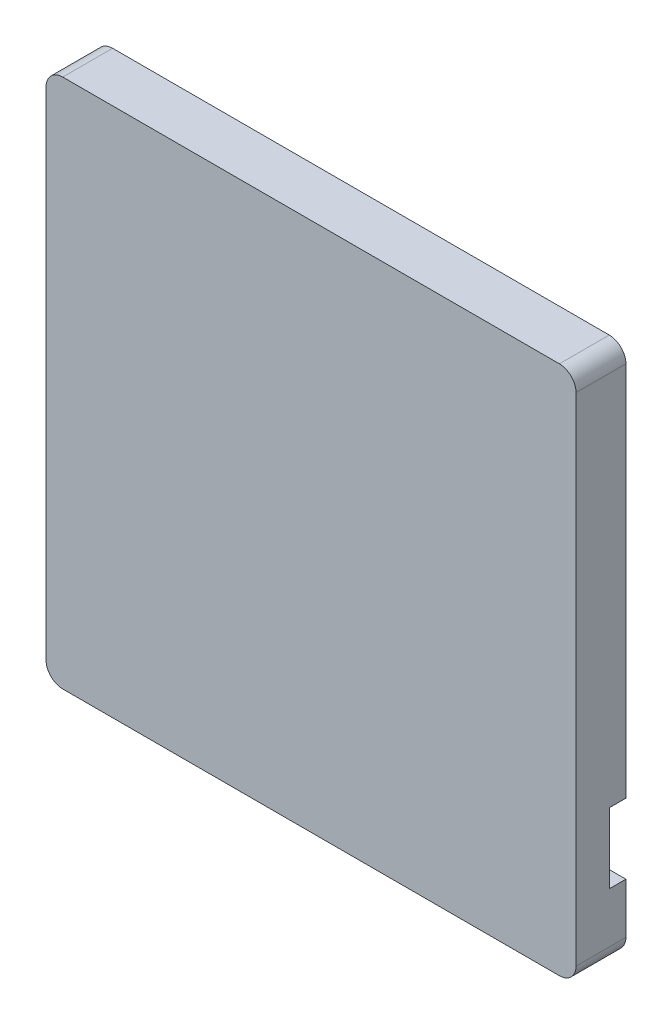
ISO-10303-21;
HEADER;
FILE_DESCRIPTION(('STEP AP214'),'2;1');
FILE_NAME('part.step','',(''),(''),'','','');
FILE_SCHEMA(('AUTOMOTIVE_DESIGN { 1 0 10303 214 1 1 1 1 }'));
ENDSEC;
DATA;
#1=APPLICATION_CONTEXT('core data for automotive mechanical design processes');
#2=APPLICATION_PROTOCOL_DEFINITION('international standard','automotive_design',2000,#1);
#3=PRODUCT_CONTEXT('',#1,'mechanical');
#4=PRODUCT('Part','Part','',(#3));
#5=PRODUCT_RELATED_PRODUCT_CATEGORY('part','',(#4));
#6=PRODUCT_DEFINITION_FORMATION('','',#4);
#7=PRODUCT_DEFINITION_CONTEXT('part definition',#1,'design');
#8=PRODUCT_DEFINITION('design','',#6,#7);
#9=PRODUCT_DEFINITION_SHAPE('','',#8);
#10=(LENGTH_UNIT() NAMED_UNIT(*) SI_UNIT(.MILLI.,.METRE.));
#11=(NAMED_UNIT(*) PLANE_ANGLE_UNIT() SI_UNIT($,.RADIAN.));
#12=(NAMED_UNIT(*) SI_UNIT($,.STERADIAN.) SOLID_ANGLE_UNIT());
#13=UNCERTAINTY_MEASURE_WITH_UNIT(LENGTH_MEASURE(1.E-05),#10,'distance_accuracy_value','');
#14=(GEOMETRIC_REPRESENTATION_CONTEXT(3) GLOBAL_UNCERTAINTY_ASSIGNED_CONTEXT((#13)) GLOBAL_UNIT_ASSIGNED_CONTEXT((#10,
#11,#12)) REPRESENTATION_CONTEXT('',''));
#15=CARTESIAN_POINT('',(0.,0.,0.));
#16=DIRECTION('',(0.,0.,1.));
#17=DIRECTION('',(1.,0.,0.));
#18=AXIS2_PLACEMENT_3D('',#15,#16,#17);
#19=CARTESIAN_POINT('',(101.887359685943,-74.7948066727813,10.));
#20=DIRECTION('',(0.,0.,-1.));
#21=DIRECTION('',(-1.,0.,0.));
#22=AXIS2_PLACEMENT_3D('',#19,#20,#21);
#23=CYLINDRICAL_SURFACE('',#22,13.);
#24=CARTESIAN_POINT('',(101.887359685943,-74.7948066727813,0.));
#25=DIRECTION('',(0.,0.,1.));
#26=DIRECTION('',(1.,0.,0.));
#27=AXIS2_PLACEMENT_3D('',#24,#25,#26);
#28=CIRCLE('',#27,13.);
#29=CARTESIAN_POINT('',(101.887359685943,-87.7948066727813,0.));
#30=VERTEX_POINT('',#29);
#31=CARTESIAN_POINT('',(108.887359685943,-85.7492578228846,0.));
#32=VERTEX_POINT('',#31);
#33=EDGE_CURVE('E279',#30,#32,#28,.T.);
#34=ORIENTED_EDGE('',*,*,#33,.F.);
#35=DIRECTION('',(0.,0.,-1.));
#36=VECTOR('',#35,1.);
#37=CARTESIAN_POINT('',(101.887359685943,-87.7948066727813,10.));
#38=LINE('',#37,#36);
#39=CARTESIAN_POINT('',(101.887359685943,-87.7948066727813,10.));
#40=VERTEX_POINT('',#39);
#41=EDGE_CURVE('E251',#40,#30,#38,.T.);
#42=ORIENTED_EDGE('',*,*,#41,.F.);
#43=CARTESIAN_POINT('',(101.887359685943,-74.7948066727813,10.));
#44=DIRECTION('',(0.,0.,1.));
#45=DIRECTION('',(1.,0.,0.));
#46=AXIS2_PLACEMENT_3D('',#43,#44,#45);
#47=CIRCLE('',#46,13.);
#48=CARTESIAN_POINT('',(108.887359685943,-85.7492578228846,10.));
#49=VERTEX_POINT('',#48);
#50=EDGE_CURVE('E246',#40,#49,#47,.T.);
#51=ORIENTED_EDGE('',*,*,#50,.T.);
#52=DIRECTION('',(0.,0.,-1.));
#53=VECTOR('',#52,1.);
#54=CARTESIAN_POINT('',(108.887359685943,-85.7492578228846,10.));
#55=LINE('',#54,#53);
#56=EDGE_CURVE('E249',#49,#32,#55,.T.);
#57=ORIENTED_EDGE('',*,*,#56,.T.);
#58=EDGE_LOOP('',(#34,#42,#51,#57));
#59=FACE_BOUND('',#58,.T.);
#60=ADVANCED_FACE('F43',(#59),#23,.F.);
#61=CARTESIAN_POINT('',(0.,-87.7948066727813,10.));
#62=DIRECTION('',(0.,1.,0.));
#63=DIRECTION('',(0.,0.,1.));
#64=AXIS2_PLACEMENT_3D('',#61,#62,#63);
#65=PLANE('',#64);
#66=DIRECTION('',(1.,0.,0.));
#67=VECTOR('',#66,1.);
#68=CARTESIAN_POINT('',(0.,-87.7948066727813,0.));
#69=LINE('',#68,#67);
#70=CARTESIAN_POINT('',(77.887359685943,-87.7948066727813,0.));
#71=VERTEX_POINT('',#70);
#72=EDGE_CURVE('E281',#71,#30,#69,.T.);
#73=ORIENTED_EDGE('',*,*,#72,.F.);
#74=DIRECTION('',(0.,0.,-1.));
#75=VECTOR('',#74,1.);
#76=CARTESIAN_POINT('',(77.887359685943,-87.7948066727813,10.));
#77=LINE('',#76,#75);
#78=CARTESIAN_POINT('',(77.887359685943,-87.7948066727813,10.));
#79=VERTEX_POINT('',#78);
#80=EDGE_CURVE('E394',#79,#71,#77,.T.);
#81=ORIENTED_EDGE('',*,*,#80,.F.);
#82=DIRECTION('',(1.,0.,0.));
#83=VECTOR('',#82,1.);
#84=CARTESIAN_POINT('',(0.,-87.7948066727813,10.));
#85=LINE('',#84,#83);
#86=EDGE_CURVE('E256',#79,#40,#85,.T.);
#87=ORIENTED_EDGE('',*,*,#86,.T.);
#88=ORIENTED_EDGE('',*,*,#41,.T.);
#89=EDGE_LOOP('',(#73,#81,#87,#88));
#90=FACE_BOUND('',#89,.T.);
#91=ADVANCED_FACE('F530',(#90),#65,.T.);
#92=CARTESIAN_POINT('',(77.887359685943,0.,10.));
#93=DIRECTION('',(-1.,0.,0.));
#94=DIRECTION('',(0.,0.,1.));
#95=AXIS2_PLACEMENT_3D('',#92,#93,#94);
#96=PLANE('',#95);
#97=DIRECTION('',(0.,1.,0.));
#98=VECTOR('',#97,1.);
#99=CARTESIAN_POINT('',(77.887359685943,0.,0.));
#100=LINE('',#99,#98);
#101=CARTESIAN_POINT('',(77.887359685943,-121.794806672781,0.));
#102=VERTEX_POINT('',#101);
#103=EDGE_CURVE('E285',#102,#71,#100,.T.);
#104=ORIENTED_EDGE('',*,*,#103,.F.);
#105=DIRECTION('',(0.,0.,-1.));
#106=VECTOR('',#105,1.);
#107=CARTESIAN_POINT('',(77.887359685943,-121.794806672781,10.));
#108=LINE('',#107,#106);
#109=CARTESIAN_POINT('',(77.887359685943,-121.794806672781,10.));
#110=VERTEX_POINT('',#109);
#111=EDGE_CURVE('E392',#110,#102,#108,.T.);
#112=ORIENTED_EDGE('',*,*,#111,.F.);
#113=DIRECTION('',(0.,1.,0.));
#114=VECTOR('',#113,1.);
#115=CARTESIAN_POINT('',(77.887359685943,0.,10.));
#116=LINE('',#115,#114);
#117=EDGE_CURVE('E464',#110,#79,#116,.T.);
#118=ORIENTED_EDGE('',*,*,#117,.T.);
#119=ORIENTED_EDGE('',*,*,#80,.T.);
#120=EDGE_LOOP('',(#104,#112,#118,#119));
#121=FACE_BOUND('',#120,.T.);
#122=ADVANCED_FACE('F535',(#121),#96,.T.);
#123=CARTESIAN_POINT('',(0.,-121.794806672781,10.));
#124=DIRECTION('',(0.,1.,0.));
#125=DIRECTION('',(0.,0.,1.));
#126=AXIS2_PLACEMENT_3D('',#123,#124,#125);
#127=PLANE('',#126);
#128=DIRECTION('',(1.,0.,0.));
#129=VECTOR('',#128,1.);
#130=CARTESIAN_POINT('',(0.,-121.794806672781,0.));
#131=LINE('',#130,#129);
#132=CARTESIAN_POINT('',(-54.112640314057,-121.794806672781,0.));
#133=VERTEX_POINT('',#132);
#134=EDGE_CURVE('E288',#133,#102,#131,.T.);
#135=ORIENTED_EDGE('',*,*,#134,.F.);
#136=DIRECTION('',(0.,0.,-1.));
#137=VECTOR('',#136,1.);
#138=CARTESIAN_POINT('',(-54.112640314057,-121.794806672781,10.));
#139=LINE('',#138,#137);
#140=CARTESIAN_POINT('',(-54.112640314057,-121.794806672781,10.));
#141=VERTEX_POINT('',#140);
#142=EDGE_CURVE('E390',#141,#133,#139,.T.);
#143=ORIENTED_EDGE('',*,*,#142,.F.);
#144=DIRECTION('',(1.,0.,0.));
#145=VECTOR('',#144,1.);
#146=CARTESIAN_POINT('',(0.,-121.794806672781,10.));
#147=LINE('',#146,#145);
#148=EDGE_CURVE('E467',#141,#110,#147,.T.);
#149=ORIENTED_EDGE('',*,*,#148,.T.);
#150=ORIENTED_EDGE('',*,*,#111,.T.);
#151=EDGE_LOOP('',(#135,#143,#149,#150));
#152=FACE_BOUND('',#151,.T.);
#153=ADVANCED_FACE('F727',(#152),#127,.T.);
#154=CARTESIAN_POINT('',(-54.112640314057,0.,10.));
#155=DIRECTION('',(1.,0.,0.));
#156=DIRECTION('',(0.,0.,-1.));
#157=AXIS2_PLACEMENT_3D('',#154,#155,#156);
#158=PLANE('',#157);
#159=DIRECTION('',(0.,-1.,0.));
#160=VECTOR('',#159,1.);
#161=CARTESIAN_POINT('',(-54.112640314057,0.,0.));
#162=LINE('',#161,#160);
#163=CARTESIAN_POINT('',(-54.112640314057,-87.7948066727813,0.));
#164=VERTEX_POINT('',#163);
#165=EDGE_CURVE('E291',#164,#133,#162,.T.);
#166=ORIENTED_EDGE('',*,*,#165,.F.);
#167=DIRECTION('',(0.,0.,-1.));
#168=VECTOR('',#167,1.);
#169=CARTESIAN_POINT('',(-54.112640314057,-87.7948066727813,10.));
#170=LINE('',#169,#168);
#171=CARTESIAN_POINT('',(-54.112640314057,-87.7948066727813,10.));
#172=VERTEX_POINT('',#171);
#173=EDGE_CURVE('E388',#172,#164,#170,.T.);
#174=ORIENTED_EDGE('',*,*,#173,.F.);
#175=DIRECTION('',(0.,-1.,0.));
#176=VECTOR('',#175,1.);
#177=CARTESIAN_POINT('',(-54.112640314057,0.,10.));
#178=LINE('',#177,#176);
#179=EDGE_CURVE('E470',#172,#141,#178,.T.);
#180=ORIENTED_EDGE('',*,*,#179,.T.);
#181=ORIENTED_EDGE('',*,*,#142,.T.);
#182=EDGE_LOOP('',(#166,#174,#180,#181));
#183=FACE_BOUND('',#182,.T.);
#184=ADVANCED_FACE('F723',(#183),#158,.T.);
#185=CARTESIAN_POINT('',(0.,-87.7948066727813,10.));
#186=DIRECTION('',(0.,1.,0.));
#187=DIRECTION('',(0.,0.,1.));
#188=AXIS2_PLACEMENT_3D('',#185,#186,#187);
#189=PLANE('',#188);
#190=DIRECTION('',(1.,0.,0.));
#191=VECTOR('',#190,1.);
#192=CARTESIAN_POINT('',(0.,-87.7948066727813,0.));
#193=LINE('',#192,#191);
#194=CARTESIAN_POINT('',(-78.112640314057,-87.7948066727813,0.));
#195=VERTEX_POINT('',#194);
#196=EDGE_CURVE('E294',#195,#164,#193,.T.);
#197=ORIENTED_EDGE('',*,*,#196,.F.);
#198=DIRECTION('',(0.,0.,-1.));
#199=VECTOR('',#198,1.);
#200=CARTESIAN_POINT('',(-78.112640314057,-87.7948066727813,10.));
#201=LINE('',#200,#199);
#202=CARTESIAN_POINT('',(-78.112640314057,-87.7948066727813,10.));
#203=VERTEX_POINT('',#202);
#204=EDGE_CURVE('E386',#203,#195,#201,.T.);
#205=ORIENTED_EDGE('',*,*,#204,.F.);
#206=DIRECTION('',(1.,0.,0.));
#207=VECTOR('',#206,1.);
#208=CARTESIAN_POINT('',(0.,-87.7948066727813,10.));
#209=LINE('',#208,#207);
#210=EDGE_CURVE('E473',#203,#172,#209,.T.);
#211=ORIENTED_EDGE('',*,*,#210,.T.);
#212=ORIENTED_EDGE('',*,*,#173,.T.);
#213=EDGE_LOOP('',(#197,#205,#211,#212));
#214=FACE_BOUND('',#213,.T.);
#215=ADVANCED_FACE('F719',(#214),#189,.T.);
#216=CARTESIAN_POINT('',(-78.112640314057,-74.7948066727813,10.));
#217=DIRECTION('',(0.,0.,-1.));
#218=DIRECTION('',(-1.,0.,0.));
#219=AXIS2_PLACEMENT_3D('',#216,#217,#218);
#220=CYLINDRICAL_SURFACE('',#219,13.);
#221=CARTESIAN_POINT('',(-78.112640314057,-74.7948066727813,0.));
#222=DIRECTION('',(0.,0.,1.));
#223=DIRECTION('',(1.,0.,0.));
#224=AXIS2_PLACEMENT_3D('',#221,#222,#223);
#225=CIRCLE('',#224,13.);
#226=CARTESIAN_POINT('',(-91.112640314057,-74.7948066727813,0.));
#227=VERTEX_POINT('',#226);
#228=EDGE_CURVE('E297',#227,#195,#225,.T.);
#229=ORIENTED_EDGE('',*,*,#228,.F.);
#230=DIRECTION('',(0.,0.,-1.));
#231=VECTOR('',#230,1.);
#232=CARTESIAN_POINT('',(-91.112640314057,-74.7948066727813,10.));
#233=LINE('',#232,#231);
#234=CARTESIAN_POINT('',(-91.112640314057,-74.7948066727813,10.));
#235=VERTEX_POINT('',#234);
#236=EDGE_CURVE('E384',#235,#227,#233,.T.);
#237=ORIENTED_EDGE('',*,*,#236,.F.);
#238=CARTESIAN_POINT('',(-78.112640314057,-74.7948066727813,10.));
#239=DIRECTION('',(0.,0.,1.));
#240=DIRECTION('',(1.,0.,0.));
#241=AXIS2_PLACEMENT_3D('',#238,#239,#240);
#242=CIRCLE('',#241,13.);
#243=EDGE_CURVE('E476',#235,#203,#242,.T.);
#244=ORIENTED_EDGE('',*,*,#243,.T.);
#245=ORIENTED_EDGE('',*,*,#204,.T.);
#246=EDGE_LOOP('',(#229,#237,#244,#245));
#247=FACE_BOUND('',#246,.T.);
#248=ADVANCED_FACE('F715',(#247),#220,.F.);
#249=CARTESIAN_POINT('',(-91.112640314057,0.,10.));
#250=DIRECTION('',(1.,0.,0.));
#251=DIRECTION('',(0.,0.,-1.));
#252=AXIS2_PLACEMENT_3D('',#249,#250,#251);
#253=PLANE('',#252);
#254=DIRECTION('',(0.,-1.,0.));
#255=VECTOR('',#254,1.);
#256=CARTESIAN_POINT('',(-91.112640314057,0.,0.));
#257=LINE('',#256,#255);
#258=CARTESIAN_POINT('',(-91.112640314057,87.2051933272187,0.));
#259=VERTEX_POINT('',#258);
#260=EDGE_CURVE('E300',#259,#227,#257,.T.);
#261=ORIENTED_EDGE('',*,*,#260,.F.);
#262=DIRECTION('',(0.,0.,-1.));
#263=VECTOR('',#262,1.);
#264=CARTESIAN_POINT('',(-91.112640314057,87.2051933272187,10.));
#265=LINE('',#264,#263);
#266=CARTESIAN_POINT('',(-91.112640314057,87.2051933272187,10.));
#267=VERTEX_POINT('',#266);
#268=EDGE_CURVE('E382',#267,#259,#265,.T.);
#269=ORIENTED_EDGE('',*,*,#268,.F.);
#270=DIRECTION('',(0.,-1.,0.));
#271=VECTOR('',#270,1.);
#272=CARTESIAN_POINT('',(-91.112640314057,0.,10.));
#273=LINE('',#272,#271);
#274=EDGE_CURVE('E479',#267,#235,#273,.T.);
#275=ORIENTED_EDGE('',*,*,#274,.T.);
#276=ORIENTED_EDGE('',*,*,#236,.T.);
#277=EDGE_LOOP('',(#261,#269,#275,#276));
#278=FACE_BOUND('',#277,.T.);
#279=ADVANCED_FACE('F711',(#278),#253,.T.);
#280=CARTESIAN_POINT('',(-78.112640314057,87.2051933272187,10.));
#281=DIRECTION('',(0.,0.,-1.));
#282=DIRECTION('',(-1.,0.,0.));
#283=AXIS2_PLACEMENT_3D('',#280,#281,#282);
#284=CYLINDRICAL_SURFACE('',#283,13.);
#285=CARTESIAN_POINT('',(-78.112640314057,87.2051933272187,0.));
#286=DIRECTION('',(0.,0.,1.));
#287=DIRECTION('',(1.,0.,0.));
#288=AXIS2_PLACEMENT_3D('',#285,#286,#287);
#289=CIRCLE('',#288,13.);
#290=CARTESIAN_POINT('',(-78.112640314057,100.205193327219,0.));
#291=VERTEX_POINT('',#290);
#292=EDGE_CURVE('E303',#291,#259,#289,.T.);
#293=ORIENTED_EDGE('',*,*,#292,.F.);
#294=DIRECTION('',(0.,0.,-1.));
#295=VECTOR('',#294,1.);
#296=CARTESIAN_POINT('',(-78.112640314057,100.205193327219,10.));
#297=LINE('',#296,#295);
#298=CARTESIAN_POINT('',(-78.112640314057,100.205193327219,10.));
#299=VERTEX_POINT('',#298);
#300=EDGE_CURVE('E380',#299,#291,#297,.T.);
#301=ORIENTED_EDGE('',*,*,#300,.F.);
#302=CARTESIAN_POINT('',(-78.112640314057,87.2051933272187,10.));
#303=DIRECTION('',(0.,0.,1.));
#304=DIRECTION('',(1.,0.,0.));
#305=AXIS2_PLACEMENT_3D('',#302,#303,#304);
#306=CIRCLE('',#305,13.);
#307=EDGE_CURVE('E482',#299,#267,#306,.T.);
#308=ORIENTED_EDGE('',*,*,#307,.T.);
#309=ORIENTED_EDGE('',*,*,#268,.T.);
#310=EDGE_LOOP('',(#293,#301,#308,#309));
#311=FACE_BOUND('',#310,.T.);
#312=ADVANCED_FACE('F707',(#311),#284,.F.);
#313=CARTESIAN_POINT('',(0.,100.205193327219,10.));
#314=DIRECTION('',(0.,-1.,0.));
#315=DIRECTION('',(1.,0.,0.));
#316=AXIS2_PLACEMENT_3D('',#313,#314,#315);
#317=PLANE('',#316);
#318=DIRECTION('',(-1.,0.,0.));
#319=VECTOR('',#318,1.);
#320=CARTESIAN_POINT('',(0.,100.205193327219,0.));
#321=LINE('',#320,#319);
#322=CARTESIAN_POINT('',(101.887359685943,100.205193327219,0.));
#323=VERTEX_POINT('',#322);
#324=EDGE_CURVE('E306',#323,#291,#321,.T.);
#325=ORIENTED_EDGE('',*,*,#324,.F.);
#326=DIRECTION('',(0.,0.,-1.));
#327=VECTOR('',#326,1.);
#328=CARTESIAN_POINT('',(101.887359685943,100.205193327219,10.));
#329=LINE('',#328,#327);
#330=CARTESIAN_POINT('',(101.887359685943,100.205193327219,10.));
#331=VERTEX_POINT('',#330);
#332=EDGE_CURVE('E378',#331,#323,#329,.T.);
#333=ORIENTED_EDGE('',*,*,#332,.F.);
#334=DIRECTION('',(-1.,0.,0.));
#335=VECTOR('',#334,1.);
#336=CARTESIAN_POINT('',(0.,100.205193327219,10.));
#337=LINE('',#336,#335);
#338=EDGE_CURVE('E485',#331,#299,#337,.T.);
#339=ORIENTED_EDGE('',*,*,#338,.T.);
#340=ORIENTED_EDGE('',*,*,#300,.T.);
#341=EDGE_LOOP('',(#325,#333,#339,#340));
#342=FACE_BOUND('',#341,.T.);
#343=ADVANCED_FACE('F703',(#342),#317,.T.);
#344=CARTESIAN_POINT('',(101.887359685943,87.2051933272187,10.));
#345=DIRECTION('',(0.,0.,-1.));
#346=DIRECTION('',(-1.,0.,0.));
#347=AXIS2_PLACEMENT_3D('',#344,#345,#346);
#348=CYLINDRICAL_SURFACE('',#347,13.);
#349=CARTESIAN_POINT('',(101.887359685943,87.2051933272187,0.));
#350=DIRECTION('',(0.,0.,1.));
#351=DIRECTION('',(1.,0.,0.));
#352=AXIS2_PLACEMENT_3D('',#349,#350,#351);
#353=CIRCLE('',#352,13.);
#354=CARTESIAN_POINT('',(114.887359685943,87.2051933272187,0.));
#355=VERTEX_POINT('',#354);
#356=EDGE_CURVE('E309',#355,#323,#353,.T.);
#357=ORIENTED_EDGE('',*,*,#356,.F.);
#358=DIRECTION('',(0.,0.,-1.));
#359=VECTOR('',#358,1.);
#360=CARTESIAN_POINT('',(114.887359685943,87.2051933272187,10.));
#361=LINE('',#360,#359);
#362=CARTESIAN_POINT('',(114.887359685943,87.2051933272187,10.));
#363=VERTEX_POINT('',#362);
#364=EDGE_CURVE('E376',#363,#355,#361,.T.);
#365=ORIENTED_EDGE('',*,*,#364,.F.);
#366=CARTESIAN_POINT('',(101.887359685943,87.2051933272187,10.));
#367=DIRECTION('',(0.,0.,1.));
#368=DIRECTION('',(1.,0.,0.));
#369=AXIS2_PLACEMENT_3D('',#366,#367,#368);
#370=CIRCLE('',#369,13.);
#371=EDGE_CURVE('E488',#363,#331,#370,.T.);
#372=ORIENTED_EDGE('',*,*,#371,.T.);
#373=ORIENTED_EDGE('',*,*,#332,.T.);
#374=EDGE_LOOP('',(#357,#365,#372,#373));
#375=FACE_BOUND('',#374,.T.);
#376=ADVANCED_FACE('F699',(#375),#348,.F.);
#377=CARTESIAN_POINT('',(114.887359685943,0.,10.));
#378=DIRECTION('',(-1.,0.,0.));
#379=DIRECTION('',(0.,0.,1.));
#380=AXIS2_PLACEMENT_3D('',#377,#378,#379);
#381=PLANE('',#380);
#382=DIRECTION('',(0.,1.,0.));
#383=VECTOR('',#382,1.);
#384=CARTESIAN_POINT('',(114.887359685943,0.,0.));
#385=LINE('',#384,#383);
#386=CARTESIAN_POINT('',(114.887359685943,-31.2948066727814,0.));
#387=VERTEX_POINT('',#386);
#388=EDGE_CURVE('E312',#387,#355,#385,.T.);
#389=ORIENTED_EDGE('',*,*,#388,.F.);
#390=DIRECTION('',(0.,0.,-1.));
#391=VECTOR('',#390,1.);
#392=CARTESIAN_POINT('',(114.887359685943,-31.2948066727814,10.));
#393=LINE('',#392,#391);
#394=CARTESIAN_POINT('',(114.887359685943,-31.2948066727814,10.));
#395=VERTEX_POINT('',#394);
#396=EDGE_CURVE('E374',#395,#387,#393,.T.);
#397=ORIENTED_EDGE('',*,*,#396,.F.);
#398=DIRECTION('',(0.,1.,0.));
#399=VECTOR('',#398,1.);
#400=CARTESIAN_POINT('',(114.887359685943,0.,10.));
#401=LINE('',#400,#399);
#402=EDGE_CURVE('E491',#395,#363,#401,.T.);
#403=ORIENTED_EDGE('',*,*,#402,.T.);
#404=ORIENTED_EDGE('',*,*,#364,.T.);
#405=EDGE_LOOP('',(#389,#397,#403,#404));
#406=FACE_BOUND('',#405,.T.);
#407=ADVANCED_FACE('F695',(#406),#381,.T.);
#408=CARTESIAN_POINT('',(0.,-31.2948066727814,10.));
#409=DIRECTION('',(0.,1.,0.));
#410=DIRECTION('',(0.,0.,1.));
#411=AXIS2_PLACEMENT_3D('',#408,#409,#410);
#412=PLANE('',#411);
#413=DIRECTION('',(1.,0.,0.));
#414=VECTOR('',#413,1.);
#415=CARTESIAN_POINT('',(0.,-31.2948066727814,0.));
#416=LINE('',#415,#414);
#417=CARTESIAN_POINT('',(133.387359685943,-31.2948066727814,0.));
#418=VERTEX_POINT('',#417);
#419=EDGE_CURVE('E315',#387,#418,#416,.T.);
#420=ORIENTED_EDGE('',*,*,#419,.T.);
#421=DIRECTION('',(0.,0.,-1.));
#422=VECTOR('',#421,1.);
#423=CARTESIAN_POINT('',(133.387359685943,-31.2948066727814,10.));
#424=LINE('',#423,#422);
#425=CARTESIAN_POINT('',(133.387359685943,-31.2948066727814,10.));
#426=VERTEX_POINT('',#425);
#427=EDGE_CURVE('E371',#426,#418,#424,.T.);
#428=ORIENTED_EDGE('',*,*,#427,.F.);
#429=DIRECTION('',(1.,0.,0.));
#430=VECTOR('',#429,1.);
#431=CARTESIAN_POINT('',(0.,-31.2948066727814,10.));
#432=LINE('',#431,#430);
#433=EDGE_CURVE('E494',#395,#426,#432,.T.);
#434=ORIENTED_EDGE('',*,*,#433,.F.);
#435=ORIENTED_EDGE('',*,*,#396,.T.);
#436=EDGE_LOOP('',(#420,#428,#434,#435));
#437=FACE_BOUND('',#436,.T.);
#438=ADVANCED_FACE('F691',(#437),#412,.F.);
#439=CARTESIAN_POINT('',(133.387359685943,0.,10.));
#440=DIRECTION('',(1.,0.,0.));
#441=DIRECTION('',(0.,0.,-1.));
#442=AXIS2_PLACEMENT_3D('',#439,#440,#441);
#443=PLANE('',#442);
#444=DIRECTION('',(0.,-1.,0.));
#445=VECTOR('',#444,1.);
#446=CARTESIAN_POINT('',(133.387359685943,0.,0.));
#447=LINE('',#446,#445);
#448=CARTESIAN_POINT('',(133.387359685943,-73.7948066727814,0.));
#449=VERTEX_POINT('',#448);
#450=EDGE_CURVE('E317',#418,#449,#447,.T.);
#451=ORIENTED_EDGE('',*,*,#450,.T.);
#452=DIRECTION('',(0.,0.,-1.));
#453=VECTOR('',#452,1.);
#454=CARTESIAN_POINT('',(133.387359685943,-73.7948066727814,10.));
#455=LINE('',#454,#453);
#456=CARTESIAN_POINT('',(133.387359685943,-73.7948066727814,10.));
#457=VERTEX_POINT('',#456);
#458=EDGE_CURVE('E368',#457,#449,#455,.T.);
#459=ORIENTED_EDGE('',*,*,#458,.F.);
#460=DIRECTION('',(0.,-1.,0.));
#461=VECTOR('',#460,1.);
#462=CARTESIAN_POINT('',(133.387359685943,0.,10.));
#463=LINE('',#462,#461);
#464=EDGE_CURVE('E497',#426,#457,#463,.T.);
#465=ORIENTED_EDGE('',*,*,#464,.F.);
#466=ORIENTED_EDGE('',*,*,#427,.T.);
#467=EDGE_LOOP('',(#451,#459,#465,#466));
#468=FACE_BOUND('',#467,.T.);
#469=ADVANCED_FACE('F687',(#468),#443,.F.);
#470=CARTESIAN_POINT('',(0.,-73.7948066727814,10.));
#471=DIRECTION('',(0.,-1.,0.));
#472=DIRECTION('',(0.,0.,-1.));
#473=AXIS2_PLACEMENT_3D('',#470,#471,#472);
#474=PLANE('',#473);
#475=DIRECTION('',(-1.,0.,0.));
#476=VECTOR('',#475,1.);
#477=CARTESIAN_POINT('',(0.,-73.7948066727814,0.));
#478=LINE('',#477,#476);
#479=CARTESIAN_POINT('',(129.887359685943,-73.7948066727814,0.));
#480=VERTEX_POINT('',#479);
#481=EDGE_CURVE('E319',#449,#480,#478,.T.);
#482=ORIENTED_EDGE('',*,*,#481,.T.);
#483=DIRECTION('',(0.,0.,-1.));
#484=VECTOR('',#483,1.);
#485=CARTESIAN_POINT('',(129.887359685943,-73.7948066727814,10.));
#486=LINE('',#485,#484);
#487=CARTESIAN_POINT('',(129.887359685943,-73.7948066727814,10.));
#488=VERTEX_POINT('',#487);
#489=EDGE_CURVE('E366',#488,#480,#486,.T.);
#490=ORIENTED_EDGE('',*,*,#489,.F.);
#491=DIRECTION('',(-1.,0.,0.));
#492=VECTOR('',#491,1.);
#493=CARTESIAN_POINT('',(0.,-73.7948066727814,10.));
#494=LINE('',#493,#492);
#495=EDGE_CURVE('E500',#457,#488,#494,.T.);
#496=ORIENTED_EDGE('',*,*,#495,.F.);
#497=ORIENTED_EDGE('',*,*,#458,.T.);
#498=EDGE_LOOP('',(#482,#490,#496,#497));
#499=FACE_BOUND('',#498,.T.);
#500=ADVANCED_FACE('F683',(#499),#474,.F.);
#501=CARTESIAN_POINT('',(129.887359685943,0.,10.));
#502=DIRECTION('',(-1.,0.,0.));
#503=DIRECTION('',(0.,0.,1.));
#504=AXIS2_PLACEMENT_3D('',#501,#502,#503);
#505=PLANE('',#504);
#506=DIRECTION('',(0.,1.,0.));
#507=VECTOR('',#506,1.);
#508=CARTESIAN_POINT('',(129.887359685943,0.,0.));
#509=LINE('',#508,#507);
#510=CARTESIAN_POINT('',(129.887359685943,-79.6948066727814,0.));
#511=VERTEX_POINT('',#510);
#512=EDGE_CURVE('E322',#511,#480,#509,.T.);
#513=ORIENTED_EDGE('',*,*,#512,.F.);
#514=DIRECTION('',(0.,0.,-1.));
#515=VECTOR('',#514,1.);
#516=CARTESIAN_POINT('',(129.887359685943,-79.6948066727814,10.));
#517=LINE('',#516,#515);
#518=CARTESIAN_POINT('',(129.887359685943,-79.6948066727814,10.));
#519=VERTEX_POINT('',#518);
#520=EDGE_CURVE('E364',#519,#511,#517,.T.);
#521=ORIENTED_EDGE('',*,*,#520,.F.);
#522=DIRECTION('',(0.,1.,0.));
#523=VECTOR('',#522,1.);
#524=CARTESIAN_POINT('',(129.887359685943,0.,10.));
#525=LINE('',#524,#523);
#526=EDGE_CURVE('E503',#519,#488,#525,.T.);
#527=ORIENTED_EDGE('',*,*,#526,.T.);
#528=ORIENTED_EDGE('',*,*,#489,.T.);
#529=EDGE_LOOP('',(#513,#521,#527,#528));
#530=FACE_BOUND('',#529,.T.);
#531=ADVANCED_FACE('F679',(#530),#505,.T.);
#532=CARTESIAN_POINT('',(0.,-79.6948066727814,10.));
#533=DIRECTION('',(0.,-1.,0.));
#534=DIRECTION('',(0.,0.,-1.));
#535=AXIS2_PLACEMENT_3D('',#532,#533,#534);
#536=PLANE('',#535);
#537=DIRECTION('',(-1.,0.,0.));
#538=VECTOR('',#537,1.);
#539=CARTESIAN_POINT('',(0.,-79.6948066727814,0.));
#540=LINE('',#539,#538);
#541=CARTESIAN_POINT('',(171.29642467285,-79.6948066727814,0.));
#542=VERTEX_POINT('',#541);
#543=EDGE_CURVE('E325',#542,#511,#540,.T.);
#544=ORIENTED_EDGE('',*,*,#543,.F.);
#545=DIRECTION('',(0.,0.,-1.));
#546=VECTOR('',#545,1.);
#547=CARTESIAN_POINT('',(171.29642467285,-79.6948066727814,10.));
#548=LINE('',#547,#546);
#549=CARTESIAN_POINT('',(171.29642467285,-79.6948066727814,10.));
#550=VERTEX_POINT('',#549);
#551=EDGE_CURVE('E361',#550,#542,#548,.T.);
#552=ORIENTED_EDGE('',*,*,#551,.F.);
#553=DIRECTION('',(-1.,0.,0.));
#554=VECTOR('',#553,1.);
#555=CARTESIAN_POINT('',(0.,-79.6948066727814,10.));
#556=LINE('',#555,#554);
#557=EDGE_CURVE('E506',#550,#519,#556,.T.);
#558=ORIENTED_EDGE('',*,*,#557,.T.);
#559=ORIENTED_EDGE('',*,*,#520,.T.);
#560=EDGE_LOOP('',(#544,#552,#558,#559));
#561=FACE_BOUND('',#560,.T.);
#562=ADVANCED_FACE('F601',(#561),#536,.T.);
#563=CARTESIAN_POINT('',(0.,156.614258314126,10.));
#564=DIRECTION('',(0.,1.,0.));
#565=DIRECTION('',(0.,0.,1.));
#566=AXIS2_PLACEMENT_3D('',#563,#564,#565);
#567=PLANE('',#566);
#568=DIRECTION('',(1.,0.,0.));
#569=VECTOR('',#568,1.);
#570=CARTESIAN_POINT('',(0.,156.614258314126,0.));
#571=LINE('',#570,#569);
#572=CARTESIAN_POINT('',(-137.521705300964,156.614258314126,0.));
#573=VERTEX_POINT('',#572);
#574=CARTESIAN_POINT('',(161.29642467285,156.614258314126,0.));
#575=VERTEX_POINT('',#574);
#576=EDGE_CURVE('E330',#573,#575,#571,.T.);
#577=ORIENTED_EDGE('',*,*,#576,.F.);
#578=DIRECTION('',(0.,0.,-1.));
#579=VECTOR('',#578,1.);
#580=CARTESIAN_POINT('',(-137.521705300964,156.614258314126,30.));
#581=LINE('',#580,#579);
#582=CARTESIAN_POINT('',(-137.521705300964,156.614258314126,30.));
#583=VERTEX_POINT('',#582);
#584=EDGE_CURVE('E58',#573,#583,#581,.F.);
#585=ORIENTED_EDGE('',*,*,#584,.T.);
#586=DIRECTION('',(-1.,0.,0.));
#587=VECTOR('',#586,1.);
#588=CARTESIAN_POINT('',(171.29642467285,156.614258314126,30.));
#589=LINE('',#588,#587);
#590=CARTESIAN_POINT('',(161.29642467285,156.614258314126,30.));
#591=VERTEX_POINT('',#590);
#592=EDGE_CURVE('E456',#591,#583,#589,.T.);
#593=ORIENTED_EDGE('',*,*,#592,.F.);
#594=DIRECTION('',(0.,0.,-1.));
#595=VECTOR('',#594,1.);
#596=CARTESIAN_POINT('',(161.29642467285,156.614258314126,10.));
#597=LINE('',#596,#595);
#598=EDGE_CURVE('E425',#591,#575,#597,.T.);
#599=ORIENTED_EDGE('',*,*,#598,.T.);
#600=EDGE_LOOP('',(#577,#585,#593,#599));
#601=FACE_BOUND('',#600,.T.);
#602=ADVANCED_FACE('F556',(#601),#567,.T.);
#603=CARTESIAN_POINT('',(-147.521705300964,0.,10.));
#604=DIRECTION('',(1.,0.,0.));
#605=DIRECTION('',(0.,1.,0.));
#606=AXIS2_PLACEMENT_3D('',#603,#604,#605);
#607=PLANE('',#606);
#608=DIRECTION('',(0.,-1.,0.));
#609=VECTOR('',#608,1.);
#610=CARTESIAN_POINT('',(-147.521705300964,0.,0.));
#611=LINE('',#610,#609);
#612=CARTESIAN_POINT('',(-147.521705300964,146.614258314126,0.));
#613=VERTEX_POINT('',#612);
#614=CARTESIAN_POINT('',(-147.521705300964,-152.203871659689,0.));
#615=VERTEX_POINT('',#614);
#616=EDGE_CURVE('E334',#613,#615,#611,.T.);
#617=ORIENTED_EDGE('',*,*,#616,.T.);
#618=DIRECTION('',(0.,0.,-1.));
#619=VECTOR('',#618,1.);
#620=CARTESIAN_POINT('',(-147.521705300964,-152.203871659689,10.));
#621=LINE('',#620,#619);
#622=CARTESIAN_POINT('',(-147.521705300964,-152.203871659689,30.));
#623=VERTEX_POINT('',#622);
#624=EDGE_CURVE('E416',#615,#623,#621,.F.);
#625=ORIENTED_EDGE('',*,*,#624,.T.);
#626=DIRECTION('',(0.,-1.,0.));
#627=VECTOR('',#626,1.);
#628=CARTESIAN_POINT('',(-147.521705300964,-162.203871659689,30.));
#629=LINE('',#628,#627);
#630=CARTESIAN_POINT('',(-147.521705300964,146.614258314126,30.));
#631=VERTEX_POINT('',#630);
#632=EDGE_CURVE('E565',#631,#623,#629,.T.);
#633=ORIENTED_EDGE('',*,*,#632,.F.);
#634=DIRECTION('',(0.,0.,-1.));
#635=VECTOR('',#634,1.);
#636=CARTESIAN_POINT('',(-147.521705300964,146.614258314126,0.));
#637=LINE('',#636,#635);
#638=EDGE_CURVE('E413',#631,#613,#637,.T.);
#639=ORIENTED_EDGE('',*,*,#638,.T.);
#640=EDGE_LOOP('',(#617,#625,#633,#639));
#641=FACE_BOUND('',#640,.T.);
#642=ADVANCED_FACE('F562',(#641),#607,.F.);
#643=CARTESIAN_POINT('',(0.,-162.203871659689,10.));
#644=DIRECTION('',(0.,1.,0.));
#645=DIRECTION('',(0.,0.,1.));
#646=AXIS2_PLACEMENT_3D('',#643,#644,#645);
#647=PLANE('',#646);
#648=DIRECTION('',(1.,0.,0.));
#649=VECTOR('',#648,1.);
#650=CARTESIAN_POINT('',(171.29642467285,-162.203871659689,30.));
#651=LINE('',#650,#649);
#652=CARTESIAN_POINT('',(-137.521705300964,-162.203871659689,30.));
#653=VERTEX_POINT('',#652);
#654=CARTESIAN_POINT('',(161.29642467285,-162.203871659689,30.));
#655=VERTEX_POINT('',#654);
#656=EDGE_CURVE('E282',#653,#655,#651,.T.);
#657=ORIENTED_EDGE('',*,*,#656,.F.);
#658=DIRECTION('',(0.,0.,-1.));
#659=VECTOR('',#658,1.);
#660=CARTESIAN_POINT('',(-137.521705300964,-162.203871659689,10.));
#661=LINE('',#660,#659);
#662=CARTESIAN_POINT('',(-137.521705300964,-162.203871659689,0.));
#663=VERTEX_POINT('',#662);
#664=EDGE_CURVE('E402',#653,#663,#661,.T.);
#665=ORIENTED_EDGE('',*,*,#664,.T.);
#666=DIRECTION('',(1.,0.,0.));
#667=VECTOR('',#666,1.);
#668=CARTESIAN_POINT('',(0.,-162.203871659689,0.));
#669=LINE('',#668,#667);
#670=CARTESIAN_POINT('',(161.29642467285,-162.203871659689,0.));
#671=VERTEX_POINT('',#670);
#672=EDGE_CURVE('E337',#663,#671,#669,.T.);
#673=ORIENTED_EDGE('',*,*,#672,.T.);
#674=DIRECTION('',(0.,0.,-1.));
#675=VECTOR('',#674,1.);
#676=CARTESIAN_POINT('',(161.29642467285,-162.203871659689,30.));
#677=LINE('',#676,#675);
#678=EDGE_CURVE('E400',#671,#655,#677,.F.);
#679=ORIENTED_EDGE('',*,*,#678,.T.);
#680=EDGE_LOOP('',(#657,#665,#673,#679));
#681=FACE_BOUND('',#680,.T.);
#682=ADVANCED_FACE('F610',(#681),#647,.F.);
#683=CARTESIAN_POINT('',(171.29642467285,0.,10.));
#684=DIRECTION('',(1.,0.,0.));
#685=DIRECTION('',(0.,1.,0.));
#686=AXIS2_PLACEMENT_3D('',#683,#684,#685);
#687=PLANE('',#686);
#688=DIRECTION('',(0.,-1.,0.));
#689=VECTOR('',#688,1.);
#690=CARTESIAN_POINT('',(171.29642467285,0.,0.));
#691=LINE('',#690,#689);
#692=CARTESIAN_POINT('',(171.29642467285,146.614258314126,0.));
#693=VERTEX_POINT('',#692);
#694=EDGE_CURVE('E328',#693,#542,#691,.T.);
#695=ORIENTED_EDGE('',*,*,#694,.F.);
#696=DIRECTION('',(0.,0.,-1.));
#697=VECTOR('',#696,1.);
#698=CARTESIAN_POINT('',(171.29642467285,146.614258314126,10.));
#699=LINE('',#698,#697);
#700=CARTESIAN_POINT('',(171.29642467285,146.614258314126,30.));
#701=VERTEX_POINT('',#700);
#702=EDGE_CURVE('E11',#693,#701,#699,.F.);
#703=ORIENTED_EDGE('',*,*,#702,.T.);
#704=DIRECTION('',(0.,1.,0.));
#705=VECTOR('',#704,1.);
#706=CARTESIAN_POINT('',(171.29642467285,-162.203871659689,30.));
#707=LINE('',#706,#705);
#708=CARTESIAN_POINT('',(171.29642467285,-152.203871659689,30.));
#709=VERTEX_POINT('',#708);
#710=EDGE_CURVE('E436',#709,#701,#707,.T.);
#711=ORIENTED_EDGE('',*,*,#710,.F.);
#712=DIRECTION('',(0.,0.,-1.));
#713=VECTOR('',#712,1.);
#714=CARTESIAN_POINT('',(171.29642467285,-152.203871659689,0.));
#715=LINE('',#714,#713);
#716=CARTESIAN_POINT('',(171.29642467285,-152.203871659689,0.));
#717=VERTEX_POINT('',#716);
#718=EDGE_CURVE('E51',#709,#717,#715,.T.);
#719=ORIENTED_EDGE('',*,*,#718,.T.);
#720=CARTESIAN_POINT('',(171.29642467285,-121.894806672781,0.));
#721=VERTEX_POINT('',#720);
#722=EDGE_CURVE('E331',#721,#717,#691,.T.);
#723=ORIENTED_EDGE('',*,*,#722,.F.);
#724=DIRECTION('',(0.,0.,-1.));
#725=VECTOR('',#724,1.);
#726=CARTESIAN_POINT('',(171.29642467285,-121.894806672781,10.));
#727=LINE('',#726,#725);
#728=CARTESIAN_POINT('',(171.29642467285,-121.894806672781,10.));
#729=VERTEX_POINT('',#728);
#730=EDGE_CURVE('E359',#729,#721,#727,.T.);
#731=ORIENTED_EDGE('',*,*,#730,.F.);
#732=DIRECTION('',(0.,1.,0.));
#733=VECTOR('',#732,1.);
#734=CARTESIAN_POINT('',(171.29642467285,-162.203871659689,10.));
#735=LINE('',#734,#733);
#736=EDGE_CURVE('E452',#729,#550,#735,.T.);
#737=ORIENTED_EDGE('',*,*,#736,.T.);
#738=ORIENTED_EDGE('',*,*,#551,.T.);
#739=EDGE_LOOP('',(#695,#703,#711,#719,#723,#731,#737,#738));
#740=FACE_BOUND('',#739,.T.);
#741=ADVANCED_FACE('F435',(#740),#687,.T.);
#742=CARTESIAN_POINT('',(0.,-121.894806672781,10.));
#743=DIRECTION('',(0.,1.,0.));
#744=DIRECTION('',(0.,0.,1.));
#745=AXIS2_PLACEMENT_3D('',#742,#743,#744);
#746=PLANE('',#745);
#747=DIRECTION('',(1.,0.,0.));
#748=VECTOR('',#747,1.);
#749=CARTESIAN_POINT('',(0.,-121.894806672781,0.));
#750=LINE('',#749,#748);
#751=CARTESIAN_POINT('',(129.887359685943,-121.894806672781,0.));
#752=VERTEX_POINT('',#751);
#753=EDGE_CURVE('E340',#752,#721,#750,.T.);
#754=ORIENTED_EDGE('',*,*,#753,.F.);
#755=DIRECTION('',(0.,0.,-1.));
#756=VECTOR('',#755,1.);
#757=CARTESIAN_POINT('',(129.887359685943,-121.894806672781,10.));
#758=LINE('',#757,#756);
#759=CARTESIAN_POINT('',(129.887359685943,-121.894806672781,10.));
#760=VERTEX_POINT('',#759);
#761=EDGE_CURVE('E357',#760,#752,#758,.T.);
#762=ORIENTED_EDGE('',*,*,#761,.F.);
#763=DIRECTION('',(1.,0.,0.));
#764=VECTOR('',#763,1.);
#765=CARTESIAN_POINT('',(0.,-121.894806672781,10.));
#766=LINE('',#765,#764);
#767=EDGE_CURVE('E449',#760,#729,#766,.T.);
#768=ORIENTED_EDGE('',*,*,#767,.T.);
#769=ORIENTED_EDGE('',*,*,#730,.T.);
#770=EDGE_LOOP('',(#754,#762,#768,#769));
#771=FACE_BOUND('',#770,.T.);
#772=ADVANCED_FACE('F445',(#771),#746,.T.);
#773=CARTESIAN_POINT('',(129.887359685943,4.85722573273506E-13,10.));
#774=DIRECTION('',(-1.,0.,0.));
#775=DIRECTION('',(0.,-1.,0.));
#776=AXIS2_PLACEMENT_3D('',#773,#774,#775);
#777=PLANE('',#776);
#778=DIRECTION('',(0.,1.,0.));
#779=VECTOR('',#778,1.);
#780=CARTESIAN_POINT('',(129.887359685943,4.85722573273506E-13,0.));
#781=LINE('',#780,#779);
#782=CARTESIAN_POINT('',(129.887359685943,-129.352869656924,0.));
#783=VERTEX_POINT('',#782);
#784=EDGE_CURVE('E343',#783,#752,#781,.T.);
#785=ORIENTED_EDGE('',*,*,#784,.F.);
#786=DIRECTION('',(0.,0.,-1.));
#787=VECTOR('',#786,1.);
#788=CARTESIAN_POINT('',(129.887359685943,-129.352869656924,10.));
#789=LINE('',#788,#787);
#790=CARTESIAN_POINT('',(129.887359685943,-129.352869656924,10.));
#791=VERTEX_POINT('',#790);
#792=EDGE_CURVE('E355',#791,#783,#789,.T.);
#793=ORIENTED_EDGE('',*,*,#792,.F.);
#794=DIRECTION('',(0.,1.,0.));
#795=VECTOR('',#794,1.);
#796=CARTESIAN_POINT('',(129.887359685943,4.85722573273506E-13,10.));
#797=LINE('',#796,#795);
#798=EDGE_CURVE('E510',#791,#760,#797,.T.);
#799=ORIENTED_EDGE('',*,*,#798,.T.);
#800=ORIENTED_EDGE('',*,*,#761,.T.);
#801=EDGE_LOOP('',(#785,#793,#799,#800));
#802=FACE_BOUND('',#801,.T.);
#803=ADVANCED_FACE('F517',(#802),#777,.T.);
#804=CARTESIAN_POINT('',(-1.29585261235657,-128.025050549456,10.));
#805=DIRECTION('',(0.0101213491454802,0.999948777833882,0.));
#806=DIRECTION('',(-0.999948777833883,0.0101213491454802,0.));
#807=AXIS2_PLACEMENT_3D('',#804,#805,#806);
#808=PLANE('',#807);
#809=DIRECTION('',(0.999948777833883,-0.0101213491454802,0.));
#810=VECTOR('',#809,1.);
#811=CARTESIAN_POINT('',(-1.29585261235657,-128.025050549456,0.));
#812=LINE('',#811,#810);
#813=CARTESIAN_POINT('',(124.150969290152,-129.294806672781,0.));
#814=VERTEX_POINT('',#813);
#815=EDGE_CURVE('E346',#814,#783,#812,.T.);
#816=ORIENTED_EDGE('',*,*,#815,.F.);
#817=DIRECTION('',(0.,0.,-1.));
#818=VECTOR('',#817,1.);
#819=CARTESIAN_POINT('',(124.150969290152,-129.294806672781,10.));
#820=LINE('',#819,#818);
#821=CARTESIAN_POINT('',(124.150969290152,-129.294806672781,10.));
#822=VERTEX_POINT('',#821);
#823=EDGE_CURVE('E353',#822,#814,#820,.T.);
#824=ORIENTED_EDGE('',*,*,#823,.F.);
#825=DIRECTION('',(0.999948777833883,-0.0101213491454802,0.));
#826=VECTOR('',#825,1.);
#827=CARTESIAN_POINT('',(-1.29585261235657,-128.025050549456,10.));
#828=LINE('',#827,#826);
#829=EDGE_CURVE('E275',#822,#791,#828,.T.);
#830=ORIENTED_EDGE('',*,*,#829,.T.);
#831=ORIENTED_EDGE('',*,*,#792,.T.);
#832=EDGE_LOOP('',(#816,#824,#830,#831));
#833=FACE_BOUND('',#832,.T.);
#834=ADVANCED_FACE('F515',(#833),#808,.T.);
#835=CARTESIAN_POINT('',(0.,-129.294806672781,10.));
#836=DIRECTION('',(0.,-1.,0.));
#837=DIRECTION('',(0.,0.,-1.));
#838=AXIS2_PLACEMENT_3D('',#835,#836,#837);
#839=PLANE('',#838);
#840=DIRECTION('',(-1.,0.,0.));
#841=VECTOR('',#840,1.);
#842=CARTESIAN_POINT('',(0.,-129.294806672781,0.));
#843=LINE('',#842,#841);
#844=CARTESIAN_POINT('',(108.887359685943,-129.294806672781,0.));
#845=VERTEX_POINT('',#844);
#846=EDGE_CURVE('E349',#814,#845,#843,.T.);
#847=ORIENTED_EDGE('',*,*,#846,.T.);
#848=DIRECTION('',(0.,0.,-1.));
#849=VECTOR('',#848,1.);
#850=CARTESIAN_POINT('',(108.887359685943,-129.294806672781,10.));
#851=LINE('',#850,#849);
#852=CARTESIAN_POINT('',(108.887359685943,-129.294806672781,10.));
#853=VERTEX_POINT('',#852);
#854=EDGE_CURVE('E267',#853,#845,#851,.T.);
#855=ORIENTED_EDGE('',*,*,#854,.F.);
#856=DIRECTION('',(-1.,0.,0.));
#857=VECTOR('',#856,1.);
#858=CARTESIAN_POINT('',(0.,-129.294806672781,10.));
#859=LINE('',#858,#857);
#860=EDGE_CURVE('E273',#822,#853,#859,.T.);
#861=ORIENTED_EDGE('',*,*,#860,.F.);
#862=ORIENTED_EDGE('',*,*,#823,.T.);
#863=EDGE_LOOP('',(#847,#855,#861,#862));
#864=FACE_BOUND('',#863,.T.);
#865=ADVANCED_FACE('F520',(#864),#839,.F.);
#866=CARTESIAN_POINT('',(108.887359685943,0.,10.));
#867=DIRECTION('',(-1.,0.,0.));
#868=DIRECTION('',(0.,0.,1.));
#869=AXIS2_PLACEMENT_3D('',#866,#867,#868);
#870=PLANE('',#869);
#871=DIRECTION('',(0.,1.,0.));
#872=VECTOR('',#871,1.);
#873=CARTESIAN_POINT('',(108.887359685943,0.,0.));
#874=LINE('',#873,#872);
#875=EDGE_CURVE('E257',#845,#32,#874,.T.);
#876=ORIENTED_EDGE('',*,*,#875,.T.);
#877=ORIENTED_EDGE('',*,*,#56,.F.);
#878=DIRECTION('',(0.,1.,0.));
#879=VECTOR('',#878,1.);
#880=CARTESIAN_POINT('',(108.887359685943,0.,10.));
#881=LINE('',#880,#879);
#882=EDGE_CURVE('E263',#853,#49,#881,.T.);
#883=ORIENTED_EDGE('',*,*,#882,.F.);
#884=ORIENTED_EDGE('',*,*,#854,.T.);
#885=EDGE_LOOP('',(#876,#877,#883,#884));
#886=FACE_BOUND('',#885,.T.);
#887=ADVANCED_FACE('F261',(#886),#870,.F.);
#888=CARTESIAN_POINT('',(0.,0.,0.));
#889=DIRECTION('',(0.,0.,1.));
#890=DIRECTION('',(1.,0.,0.));
#891=AXIS2_PLACEMENT_3D('',#888,#889,#890);
#892=PLANE('',#891);
#893=ORIENTED_EDGE('',*,*,#672,.F.);
#894=CARTESIAN_POINT('',(-137.521705300964,-152.203871659689,0.));
#895=DIRECTION('',(0.,0.,1.));
#896=DIRECTION('',(1.,0.,0.));
#897=AXIS2_PLACEMENT_3D('',#894,#895,#896);
#898=CIRCLE('',#897,10.);
#899=EDGE_CURVE('E411',#663,#615,#898,.F.);
#900=ORIENTED_EDGE('',*,*,#899,.T.);
#901=ORIENTED_EDGE('',*,*,#616,.F.);
#902=CARTESIAN_POINT('',(-137.521705300964,146.614258314126,0.));
#903=DIRECTION('',(0.,0.,1.));
#904=DIRECTION('',(1.,0.,0.));
#905=AXIS2_PLACEMENT_3D('',#902,#903,#904);
#906=CIRCLE('',#905,10.);
#907=EDGE_CURVE('E409',#613,#573,#906,.F.);
#908=ORIENTED_EDGE('',*,*,#907,.T.);
#909=ORIENTED_EDGE('',*,*,#576,.T.);
#910=CARTESIAN_POINT('',(161.29642467285,146.614258314126,0.));
#911=DIRECTION('',(0.,0.,1.));
#912=DIRECTION('',(1.,0.,0.));
#913=AXIS2_PLACEMENT_3D('',#910,#911,#912);
#914=CIRCLE('',#913,10.);
#915=EDGE_CURVE('E407',#575,#693,#914,.F.);
#916=ORIENTED_EDGE('',*,*,#915,.T.);
#917=ORIENTED_EDGE('',*,*,#694,.T.);
#918=ORIENTED_EDGE('',*,*,#543,.T.);
#919=ORIENTED_EDGE('',*,*,#512,.T.);
#920=ORIENTED_EDGE('',*,*,#481,.F.);
#921=ORIENTED_EDGE('',*,*,#450,.F.);
#922=ORIENTED_EDGE('',*,*,#419,.F.);
#923=ORIENTED_EDGE('',*,*,#388,.T.);
#924=ORIENTED_EDGE('',*,*,#356,.T.);
#925=ORIENTED_EDGE('',*,*,#324,.T.);
#926=ORIENTED_EDGE('',*,*,#292,.T.);
#927=ORIENTED_EDGE('',*,*,#260,.T.);
#928=ORIENTED_EDGE('',*,*,#228,.T.);
#929=ORIENTED_EDGE('',*,*,#196,.T.);
#930=ORIENTED_EDGE('',*,*,#165,.T.);
#931=ORIENTED_EDGE('',*,*,#134,.T.);
#932=ORIENTED_EDGE('',*,*,#103,.T.);
#933=ORIENTED_EDGE('',*,*,#72,.T.);
#934=ORIENTED_EDGE('',*,*,#33,.T.);
#935=ORIENTED_EDGE('',*,*,#875,.F.);
#936=ORIENTED_EDGE('',*,*,#846,.F.);
#937=ORIENTED_EDGE('',*,*,#815,.T.);
#938=ORIENTED_EDGE('',*,*,#784,.T.);
#939=ORIENTED_EDGE('',*,*,#753,.T.);
#940=ORIENTED_EDGE('',*,*,#722,.T.);
#941=CARTESIAN_POINT('',(161.29642467285,-152.203871659689,0.));
#942=DIRECTION('',(0.,0.,1.));
#943=DIRECTION('',(1.,0.,0.));
#944=AXIS2_PLACEMENT_3D('',#941,#942,#943);
#945=CIRCLE('',#944,10.);
#946=EDGE_CURVE('E405',#717,#671,#945,.F.);
#947=ORIENTED_EDGE('',*,*,#946,.T.);
#948=EDGE_LOOP('',(#893,#900,#901,#908,#909,#916,#917,#918,#919,#920,#921,#922,#923,#924,#925,
#926,#927,#928,#929,#930,#931,#932,#933,#934,#935,#936,#937,#938,#939,#940,#947));
#949=FACE_BOUND('',#948,.T.);
#950=ADVANCED_FACE('F441',(#949),#892,.F.);
#951=CARTESIAN_POINT('',(0.,0.,30.));
#952=DIRECTION('',(0.,0.,1.));
#953=DIRECTION('',(1.,0.,0.));
#954=AXIS2_PLACEMENT_3D('',#951,#952,#953);
#955=PLANE('',#954);
#956=ORIENTED_EDGE('',*,*,#632,.T.);
#957=CARTESIAN_POINT('',(-137.521705300964,-152.203871659689,30.));
#958=DIRECTION('',(0.,0.,1.));
#959=DIRECTION('',(1.,0.,0.));
#960=AXIS2_PLACEMENT_3D('',#957,#958,#959);
#961=CIRCLE('',#960,10.);
#962=EDGE_CURVE('E423',#623,#653,#961,.T.);
#963=ORIENTED_EDGE('',*,*,#962,.T.);
#964=ORIENTED_EDGE('',*,*,#656,.T.);
#965=CARTESIAN_POINT('',(161.29642467285,-152.203871659689,30.));
#966=DIRECTION('',(0.,0.,1.));
#967=DIRECTION('',(1.,0.,0.));
#968=AXIS2_PLACEMENT_3D('',#965,#966,#967);
#969=CIRCLE('',#968,10.);
#970=EDGE_CURVE('E418',#655,#709,#969,.T.);
#971=ORIENTED_EDGE('',*,*,#970,.T.);
#972=ORIENTED_EDGE('',*,*,#710,.T.);
#973=CARTESIAN_POINT('',(161.29642467285,146.614258314126,30.));
#974=DIRECTION('',(0.,0.,1.));
#975=DIRECTION('',(1.,0.,0.));
#976=AXIS2_PLACEMENT_3D('',#973,#974,#975);
#977=CIRCLE('',#976,10.);
#978=EDGE_CURVE('E65',#701,#591,#977,.T.);
#979=ORIENTED_EDGE('',*,*,#978,.T.);
#980=ORIENTED_EDGE('',*,*,#592,.T.);
#981=CARTESIAN_POINT('',(-137.521705300964,146.614258314126,30.));
#982=DIRECTION('',(0.,0.,1.));
#983=DIRECTION('',(1.,0.,0.));
#984=AXIS2_PLACEMENT_3D('',#981,#982,#983);
#985=CIRCLE('',#984,10.);
#986=EDGE_CURVE('E421',#583,#631,#985,.T.);
#987=ORIENTED_EDGE('',*,*,#986,.T.);
#988=EDGE_LOOP('',(#956,#963,#964,#971,#972,#979,#980,#987));
#989=FACE_BOUND('',#988,.T.);
#990=ADVANCED_FACE('F569',(#989),#955,.T.);
#991=CARTESIAN_POINT('',(0.,0.,10.));
#992=DIRECTION('',(0.,0.,1.));
#993=DIRECTION('',(1.,0.,0.));
#994=AXIS2_PLACEMENT_3D('',#991,#992,#993);
#995=PLANE('',#994);
#996=CARTESIAN_POINT('',(11.8873596859431,-2.7948066727813,9.99999999999999));
#997=DIRECTION('',(0.,0.,1.));
#998=DIRECTION('',(1.,0.,0.));
#999=AXIS2_PLACEMENT_3D('',#996,#997,#998);
#1000=CIRCLE('',#999,42.);
#1001=CARTESIAN_POINT('',(53.887359685943,-2.7948066727813,9.99999999999999));
#1002=VERTEX_POINT('',#1001);
#1003=EDGE_CURVE('E397',#1002,#1002,#1000,.F.);
#1004=ORIENTED_EDGE('',*,*,#1003,.F.);
#1005=EDGE_LOOP('',(#1004));
#1006=FACE_BOUND('',#1005,.T.);
#1007=ORIENTED_EDGE('',*,*,#557,.F.);
#1008=ORIENTED_EDGE('',*,*,#736,.F.);
#1009=ORIENTED_EDGE('',*,*,#767,.F.);
#1010=ORIENTED_EDGE('',*,*,#798,.F.);
#1011=ORIENTED_EDGE('',*,*,#829,.F.);
#1012=ORIENTED_EDGE('',*,*,#860,.T.);
#1013=ORIENTED_EDGE('',*,*,#882,.T.);
#1014=ORIENTED_EDGE('',*,*,#50,.F.);
#1015=ORIENTED_EDGE('',*,*,#86,.F.);
#1016=ORIENTED_EDGE('',*,*,#117,.F.);
#1017=ORIENTED_EDGE('',*,*,#148,.F.);
#1018=ORIENTED_EDGE('',*,*,#179,.F.);
#1019=ORIENTED_EDGE('',*,*,#210,.F.);
#1020=ORIENTED_EDGE('',*,*,#243,.F.);
#1021=ORIENTED_EDGE('',*,*,#274,.F.);
#1022=ORIENTED_EDGE('',*,*,#307,.F.);
#1023=ORIENTED_EDGE('',*,*,#338,.F.);
#1024=ORIENTED_EDGE('',*,*,#371,.F.);
#1025=ORIENTED_EDGE('',*,*,#402,.F.);
#1026=ORIENTED_EDGE('',*,*,#433,.T.);
#1027=ORIENTED_EDGE('',*,*,#464,.T.);
#1028=ORIENTED_EDGE('',*,*,#495,.T.);
#1029=ORIENTED_EDGE('',*,*,#526,.F.);
#1030=EDGE_LOOP('',(#1007,#1008,#1009,#1010,#1011,#1012,#1013,#1014,#1015,#1016,#1017,#1018,
#1019,#1020,#1021,#1022,#1023,#1024,#1025,#1026,#1027,#1028,#1029));
#1031=FACE_BOUND('',#1030,.T.);
#1032=ADVANCED_FACE('F270',(#1006,#1031),#995,.F.);
#1033=CARTESIAN_POINT('',(11.8873596859431,-2.7948066727813,-75.));
#1034=DIRECTION('',(0.,0.,1.));
#1035=DIRECTION('',(1.,0.,0.));
#1036=AXIS2_PLACEMENT_3D('',#1033,#1034,#1035);
#1037=CYLINDRICAL_SURFACE('',#1036,42.);
#1038=CARTESIAN_POINT('',(11.8873596859431,-2.7948066727813,-75.));
#1039=DIRECTION('',(0.,0.,-1.));
#1040=DIRECTION('',(-1.,0.,0.));
#1041=AXIS2_PLACEMENT_3D('',#1038,#1039,#1040);
#1042=CIRCLE('',#1041,42.);
#1043=CARTESIAN_POINT('',(-30.1126403140569,-2.7948066727813,-75.));
#1044=VERTEX_POINT('',#1043);
#1045=EDGE_CURVE('E454',#1044,#1044,#1042,.T.);
#1046=ORIENTED_EDGE('',*,*,#1045,.F.);
#1047=EDGE_LOOP('',(#1046));
#1048=FACE_BOUND('',#1047,.T.);
#1049=ORIENTED_EDGE('',*,*,#1003,.T.);
#1050=EDGE_LOOP('',(#1049));
#1051=FACE_BOUND('',#1050,.T.);
#1052=ADVANCED_FACE('F576',(#1048,#1051),#1037,.T.);
#1053=CARTESIAN_POINT('',(0.,0.,-75.));
#1054=DIRECTION('',(0.,0.,-1.));
#1055=DIRECTION('',(-1.,0.,0.));
#1056=AXIS2_PLACEMENT_3D('',#1053,#1054,#1055);
#1057=PLANE('',#1056);
#1058=ORIENTED_EDGE('',*,*,#1045,.T.);
#1059=EDGE_LOOP('',(#1058));
#1060=FACE_BOUND('',#1059,.T.);
#1061=ADVANCED_FACE('F544',(#1060),#1057,.T.);
#1062=CARTESIAN_POINT('',(-137.521705300964,-152.203871659689,10.));
#1063=DIRECTION('',(0.,0.,-1.));
#1064=DIRECTION('',(-1.,0.,0.));
#1065=AXIS2_PLACEMENT_3D('',#1062,#1063,#1064);
#1066=CYLINDRICAL_SURFACE('',#1065,10.);
#1067=ORIENTED_EDGE('',*,*,#962,.F.);
#1068=ORIENTED_EDGE('',*,*,#624,.F.);
#1069=ORIENTED_EDGE('',*,*,#899,.F.);
#1070=ORIENTED_EDGE('',*,*,#664,.F.);
#1071=EDGE_LOOP('',(#1067,#1068,#1069,#1070));
#1072=FACE_BOUND('',#1071,.T.);
#1073=ADVANCED_FACE('F540',(#1072),#1066,.T.);
#1074=CARTESIAN_POINT('',(-137.521705300964,146.614258314126,10.));
#1075=DIRECTION('',(0.,0.,1.));
#1076=DIRECTION('',(1.,0.,0.));
#1077=AXIS2_PLACEMENT_3D('',#1074,#1075,#1076);
#1078=CYLINDRICAL_SURFACE('',#1077,10.);
#1079=ORIENTED_EDGE('',*,*,#986,.F.);
#1080=ORIENTED_EDGE('',*,*,#584,.F.);
#1081=ORIENTED_EDGE('',*,*,#907,.F.);
#1082=ORIENTED_EDGE('',*,*,#638,.F.);
#1083=EDGE_LOOP('',(#1079,#1080,#1081,#1082));
#1084=FACE_BOUND('',#1083,.T.);
#1085=ADVANCED_FACE('F543',(#1084),#1078,.T.);
#1086=CARTESIAN_POINT('',(161.29642467285,146.614258314126,10.));
#1087=DIRECTION('',(0.,0.,-1.));
#1088=DIRECTION('',(-1.,0.,0.));
#1089=AXIS2_PLACEMENT_3D('',#1086,#1087,#1088);
#1090=CYLINDRICAL_SURFACE('',#1089,10.);
#1091=ORIENTED_EDGE('',*,*,#978,.F.);
#1092=ORIENTED_EDGE('',*,*,#702,.F.);
#1093=ORIENTED_EDGE('',*,*,#915,.F.);
#1094=ORIENTED_EDGE('',*,*,#598,.F.);
#1095=EDGE_LOOP('',(#1091,#1092,#1093,#1094));
#1096=FACE_BOUND('',#1095,.T.);
#1097=ADVANCED_FACE('F547',(#1096),#1090,.T.);
#1098=CARTESIAN_POINT('',(161.29642467285,-152.203871659689,10.));
#1099=DIRECTION('',(0.,0.,1.));
#1100=DIRECTION('',(1.,0.,0.));
#1101=AXIS2_PLACEMENT_3D('',#1098,#1099,#1100);
#1102=CYLINDRICAL_SURFACE('',#1101,10.);
#1103=ORIENTED_EDGE('',*,*,#970,.F.);
#1104=ORIENTED_EDGE('',*,*,#678,.F.);
#1105=ORIENTED_EDGE('',*,*,#946,.F.);
#1106=ORIENTED_EDGE('',*,*,#718,.F.);
#1107=EDGE_LOOP('',(#1103,#1104,#1105,#1106));
#1108=FACE_BOUND('',#1107,.T.);
#1109=ADVANCED_FACE('F45',(#1108),#1102,.T.);
#1110=CLOSED_SHELL('',(#60,#91,#122,#153,#184,#215,#248,#279,#312,#343,#376,#407,#438,#469,#500,
#531,#562,#602,#642,#682,#741,#772,#803,#834,#865,#887,#950,#990,#1032,#1052,#1061,#1073,#1085,
#1097,#1109));
#1111=MANIFOLD_SOLID_BREP('B2',#1110);
#1112=ADVANCED_BREP_SHAPE_REPRESENTATION('',(#18,#1111),#14);
#1113=SHAPE_DEFINITION_REPRESENTATION(#9,#1112);
ENDSEC;
END-ISO-10303-21;
